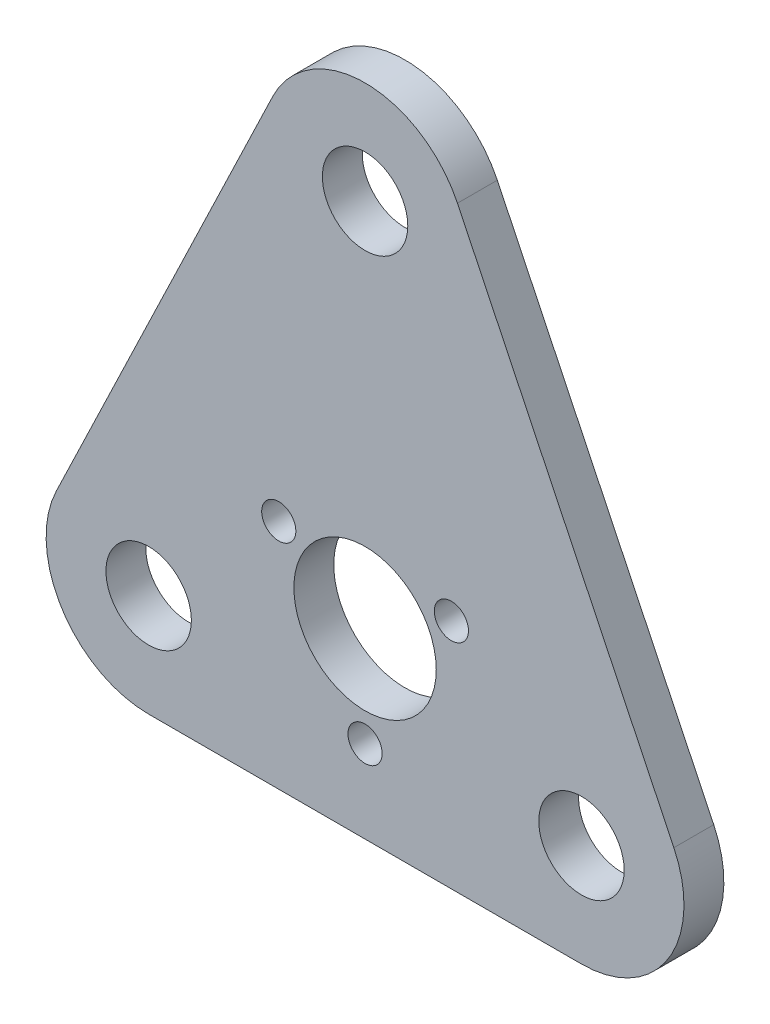
ISO-10303-21;
HEADER;
FILE_DESCRIPTION(('STEP AP214'),'2;1');
FILE_NAME('part.step','',(''),(''),'','','');
FILE_SCHEMA(('AUTOMOTIVE_DESIGN { 1 0 10303 214 1 1 1 1 }'));
ENDSEC;
DATA;
#1=APPLICATION_CONTEXT('core data for automotive mechanical design processes');
#2=APPLICATION_PROTOCOL_DEFINITION('international standard','automotive_design',2000,#1);
#3=PRODUCT_CONTEXT('',#1,'mechanical');
#4=PRODUCT('Part','Part','',(#3));
#5=PRODUCT_RELATED_PRODUCT_CATEGORY('part','',(#4));
#6=PRODUCT_DEFINITION_FORMATION('','',#4);
#7=PRODUCT_DEFINITION_CONTEXT('part definition',#1,'design');
#8=PRODUCT_DEFINITION('design','',#6,#7);
#9=PRODUCT_DEFINITION_SHAPE('','',#8);
#10=(LENGTH_UNIT() NAMED_UNIT(*) SI_UNIT(.MILLI.,.METRE.));
#11=(NAMED_UNIT(*) PLANE_ANGLE_UNIT() SI_UNIT($,.RADIAN.));
#12=(NAMED_UNIT(*) SI_UNIT($,.STERADIAN.) SOLID_ANGLE_UNIT());
#13=UNCERTAINTY_MEASURE_WITH_UNIT(LENGTH_MEASURE(1.E-05),#10,'distance_accuracy_value','');
#14=(GEOMETRIC_REPRESENTATION_CONTEXT(3) GLOBAL_UNCERTAINTY_ASSIGNED_CONTEXT((#13)) GLOBAL_UNIT_ASSIGNED_CONTEXT((#10,
#11,#12)) REPRESENTATION_CONTEXT('',''));
#15=CARTESIAN_POINT('',(0.,0.,0.));
#16=DIRECTION('',(0.,0.,1.));
#17=DIRECTION('',(1.,0.,0.));
#18=AXIS2_PLACEMENT_3D('',#15,#16,#17);
#19=CARTESIAN_POINT('',(0.,79.,3.5));
#20=DIRECTION('',(0.,0.,1.));
#21=DIRECTION('',(1.,0.,0.));
#22=AXIS2_PLACEMENT_3D('',#19,#20,#21);
#23=PLANE('',#22);
#24=CARTESIAN_POINT('',(15.1554445662277,22.75,3.5));
#25=DIRECTION('',(0.,0.,1.));
#26=DIRECTION('',(1.,0.,0.));
#27=AXIS2_PLACEMENT_3D('',#24,#25,#26);
#28=CIRCLE('',#27,3.);
#29=CARTESIAN_POINT('',(18.1554445662277,22.75,3.5));
#30=VERTEX_POINT('',#29);
#31=EDGE_CURVE('E258',#30,#30,#28,.T.);
#32=ORIENTED_EDGE('',*,*,#31,.F.);
#33=EDGE_LOOP('',(#32));
#34=FACE_BOUND('',#33,.T.);
#35=CARTESIAN_POINT('',(0.,14.,3.5));
#36=DIRECTION('',(0.,0.,1.));
#37=DIRECTION('',(1.,0.,0.));
#38=AXIS2_PLACEMENT_3D('',#35,#36,#37);
#39=CIRCLE('',#38,12.5);
#40=CARTESIAN_POINT('',(12.5,14.,3.5));
#41=VERTEX_POINT('',#40);
#42=EDGE_CURVE('E275',#41,#41,#39,.T.);
#43=ORIENTED_EDGE('',*,*,#42,.F.);
#44=EDGE_LOOP('',(#43));
#45=FACE_BOUND('',#44,.T.);
#46=CARTESIAN_POINT('',(38.,0.,3.5));
#47=DIRECTION('',(0.,0.,1.));
#48=DIRECTION('',(1.,0.,0.));
#49=AXIS2_PLACEMENT_3D('',#46,#47,#48);
#50=CIRCLE('',#49,7.5);
#51=CARTESIAN_POINT('',(45.5,0.,3.5));
#52=VERTEX_POINT('',#51);
#53=EDGE_CURVE('E286',#52,#52,#50,.T.);
#54=ORIENTED_EDGE('',*,*,#53,.F.);
#55=EDGE_LOOP('',(#54));
#56=FACE_BOUND('',#55,.T.);
#57=CARTESIAN_POINT('',(0.,79.,3.5));
#58=DIRECTION('',(0.,0.,1.));
#59=DIRECTION('',(1.,0.,0.));
#60=AXIS2_PLACEMENT_3D('',#57,#58,#59);
#61=CIRCLE('',#60,18.);
#62=CARTESIAN_POINT('',(16.2210013513531,86.8025069791319,3.5));
#63=VERTEX_POINT('',#62);
#64=CARTESIAN_POINT('',(-16.2210013513531,86.8025069791319,3.5));
#65=VERTEX_POINT('',#64);
#66=EDGE_CURVE('E174',#63,#65,#61,.T.);
#67=ORIENTED_EDGE('',*,*,#66,.T.);
#68=DIRECTION('',(-0.43347260995177,-0.901166741741838,0.));
#69=VECTOR('',#68,1.);
#70=CARTESIAN_POINT('',(-16.2210013513531,86.8025069791319,3.5));
#71=LINE('',#70,#69);
#72=CARTESIAN_POINT('',(-54.2210013513531,7.80250697913186,3.5));
#73=VERTEX_POINT('',#72);
#74=EDGE_CURVE('E120',#65,#73,#71,.T.);
#75=ORIENTED_EDGE('',*,*,#74,.T.);
#76=CARTESIAN_POINT('',(-38.,0.,3.5));
#77=DIRECTION('',(0.,0.,1.));
#78=DIRECTION('',(1.,0.,0.));
#79=AXIS2_PLACEMENT_3D('',#76,#77,#78);
#80=CIRCLE('',#79,18.);
#81=CARTESIAN_POINT('',(-38.,-18.,3.5));
#82=VERTEX_POINT('',#81);
#83=EDGE_CURVE('E133',#73,#82,#80,.T.);
#84=ORIENTED_EDGE('',*,*,#83,.T.);
#85=DIRECTION('',(1.,0.,0.));
#86=VECTOR('',#85,1.);
#87=CARTESIAN_POINT('',(-38.,-18.,3.5));
#88=LINE('',#87,#86);
#89=CARTESIAN_POINT('',(38.,-18.,3.5));
#90=VERTEX_POINT('',#89);
#91=EDGE_CURVE('E130',#82,#90,#88,.T.);
#92=ORIENTED_EDGE('',*,*,#91,.T.);
#93=CARTESIAN_POINT('',(38.,0.,3.5));
#94=DIRECTION('',(0.,0.,1.));
#95=DIRECTION('',(1.,0.,0.));
#96=AXIS2_PLACEMENT_3D('',#93,#94,#95);
#97=CIRCLE('',#96,18.);
#98=CARTESIAN_POINT('',(54.2210013513531,7.80250697913187,3.5));
#99=VERTEX_POINT('',#98);
#100=EDGE_CURVE('E131',#90,#99,#97,.T.);
#101=ORIENTED_EDGE('',*,*,#100,.T.);
#102=DIRECTION('',(-0.43347260995177,0.901166741741838,0.));
#103=VECTOR('',#102,1.);
#104=CARTESIAN_POINT('',(16.2210013513531,86.8025069791319,3.5));
#105=LINE('',#104,#103);
#106=EDGE_CURVE('E81',#99,#63,#105,.T.);
#107=ORIENTED_EDGE('',*,*,#106,.T.);
#108=EDGE_LOOP('',(#67,#75,#84,#92,#101,#107));
#109=FACE_BOUND('',#108,.T.);
#110=CARTESIAN_POINT('',(-38.,0.,3.5));
#111=DIRECTION('',(0.,0.,1.));
#112=DIRECTION('',(1.,0.,0.));
#113=AXIS2_PLACEMENT_3D('',#110,#111,#112);
#114=CIRCLE('',#113,7.5);
#115=CARTESIAN_POINT('',(-30.5,0.,3.5));
#116=VERTEX_POINT('',#115);
#117=EDGE_CURVE('E162',#116,#116,#114,.T.);
#118=ORIENTED_EDGE('',*,*,#117,.F.);
#119=EDGE_LOOP('',(#118));
#120=FACE_BOUND('',#119,.T.);
#121=CARTESIAN_POINT('',(0.,79.,3.5));
#122=DIRECTION('',(0.,0.,1.));
#123=DIRECTION('',(1.,0.,0.));
#124=AXIS2_PLACEMENT_3D('',#121,#122,#123);
#125=CIRCLE('',#124,7.5);
#126=CARTESIAN_POINT('',(7.50000000000001,79.,3.5));
#127=VERTEX_POINT('',#126);
#128=EDGE_CURVE('E279',#127,#127,#125,.T.);
#129=ORIENTED_EDGE('',*,*,#128,.F.);
#130=EDGE_LOOP('',(#129));
#131=FACE_BOUND('',#130,.T.);
#132=CARTESIAN_POINT('',(-15.1554445662277,22.7499999999999,3.5));
#133=DIRECTION('',(0.,0.,1.));
#134=DIRECTION('',(1.,0.,0.));
#135=AXIS2_PLACEMENT_3D('',#132,#133,#134);
#136=CIRCLE('',#135,3.);
#137=CARTESIAN_POINT('',(-12.1554445662277,22.7499999999999,3.5));
#138=VERTEX_POINT('',#137);
#139=EDGE_CURVE('E264',#138,#138,#136,.T.);
#140=ORIENTED_EDGE('',*,*,#139,.F.);
#141=EDGE_LOOP('',(#140));
#142=FACE_BOUND('',#141,.T.);
#143=CARTESIAN_POINT('',(0.,-3.5,3.5));
#144=DIRECTION('',(0.,0.,1.));
#145=DIRECTION('',(1.,0.,0.));
#146=AXIS2_PLACEMENT_3D('',#143,#144,#145);
#147=CIRCLE('',#146,3.);
#148=CARTESIAN_POINT('',(3.00000000000001,-3.5,3.5));
#149=VERTEX_POINT('',#148);
#150=EDGE_CURVE('E241',#149,#149,#147,.T.);
#151=ORIENTED_EDGE('',*,*,#150,.F.);
#152=EDGE_LOOP('',(#151));
#153=FACE_BOUND('',#152,.T.);
#154=ADVANCED_FACE('F62',(#34,#45,#56,#109,#120,#131,#142,#153),#23,.T.);
#155=CARTESIAN_POINT('',(0.,79.,-3.5));
#156=DIRECTION('',(0.,0.,1.));
#157=DIRECTION('',(1.,0.,0.));
#158=AXIS2_PLACEMENT_3D('',#155,#156,#157);
#159=PLANE('',#158);
#160=CARTESIAN_POINT('',(0.,79.,-3.5));
#161=DIRECTION('',(0.,0.,1.));
#162=DIRECTION('',(1.,0.,0.));
#163=AXIS2_PLACEMENT_3D('',#160,#161,#162);
#164=CIRCLE('',#163,18.);
#165=CARTESIAN_POINT('',(16.2210013513531,86.8025069791319,-3.5));
#166=VERTEX_POINT('',#165);
#167=CARTESIAN_POINT('',(-16.2210013513531,86.8025069791319,-3.5));
#168=VERTEX_POINT('',#167);
#169=EDGE_CURVE('E160',#166,#168,#164,.T.);
#170=ORIENTED_EDGE('',*,*,#169,.F.);
#171=DIRECTION('',(-0.43347260995177,0.901166741741838,0.));
#172=VECTOR('',#171,1.);
#173=CARTESIAN_POINT('',(16.2210013513531,86.8025069791319,-3.5));
#174=LINE('',#173,#172);
#175=CARTESIAN_POINT('',(54.2210013513531,7.80250697913187,-3.5));
#176=VERTEX_POINT('',#175);
#177=EDGE_CURVE('E115',#176,#166,#174,.T.);
#178=ORIENTED_EDGE('',*,*,#177,.F.);
#179=CARTESIAN_POINT('',(38.,0.,-3.5));
#180=DIRECTION('',(0.,0.,1.));
#181=DIRECTION('',(1.,0.,0.));
#182=AXIS2_PLACEMENT_3D('',#179,#180,#181);
#183=CIRCLE('',#182,18.);
#184=CARTESIAN_POINT('',(38.,-18.,-3.5));
#185=VERTEX_POINT('',#184);
#186=EDGE_CURVE('E108',#185,#176,#183,.T.);
#187=ORIENTED_EDGE('',*,*,#186,.F.);
#188=DIRECTION('',(1.,0.,0.));
#189=VECTOR('',#188,1.);
#190=CARTESIAN_POINT('',(-38.,-18.,-3.5));
#191=LINE('',#190,#189);
#192=CARTESIAN_POINT('',(-38.,-18.,-3.5));
#193=VERTEX_POINT('',#192);
#194=EDGE_CURVE('E145',#193,#185,#191,.T.);
#195=ORIENTED_EDGE('',*,*,#194,.F.);
#196=CARTESIAN_POINT('',(-38.,0.,-3.5));
#197=DIRECTION('',(0.,0.,1.));
#198=DIRECTION('',(1.,0.,0.));
#199=AXIS2_PLACEMENT_3D('',#196,#197,#198);
#200=CIRCLE('',#199,18.);
#201=CARTESIAN_POINT('',(-54.2210013513531,7.80250697913186,-3.5));
#202=VERTEX_POINT('',#201);
#203=EDGE_CURVE('E165',#202,#193,#200,.T.);
#204=ORIENTED_EDGE('',*,*,#203,.F.);
#205=DIRECTION('',(-0.43347260995177,-0.901166741741838,0.));
#206=VECTOR('',#205,1.);
#207=CARTESIAN_POINT('',(-16.2210013513531,86.8025069791319,-3.5));
#208=LINE('',#207,#206);
#209=EDGE_CURVE('E161',#168,#202,#208,.T.);
#210=ORIENTED_EDGE('',*,*,#209,.F.);
#211=EDGE_LOOP('',(#170,#178,#187,#195,#204,#210));
#212=FACE_BOUND('',#211,.T.);
#213=CARTESIAN_POINT('',(-38.,0.,-3.5));
#214=DIRECTION('',(0.,0.,1.));
#215=DIRECTION('',(1.,0.,0.));
#216=AXIS2_PLACEMENT_3D('',#213,#214,#215);
#217=CIRCLE('',#216,7.5);
#218=CARTESIAN_POINT('',(-30.5,0.,-3.5));
#219=VERTEX_POINT('',#218);
#220=EDGE_CURVE('E295',#219,#219,#217,.T.);
#221=ORIENTED_EDGE('',*,*,#220,.T.);
#222=EDGE_LOOP('',(#221));
#223=FACE_BOUND('',#222,.T.);
#224=CARTESIAN_POINT('',(38.,0.,-3.5));
#225=DIRECTION('',(0.,0.,1.));
#226=DIRECTION('',(1.,0.,0.));
#227=AXIS2_PLACEMENT_3D('',#224,#225,#226);
#228=CIRCLE('',#227,7.5);
#229=CARTESIAN_POINT('',(45.5,0.,-3.5));
#230=VERTEX_POINT('',#229);
#231=EDGE_CURVE('E281',#230,#230,#228,.T.);
#232=ORIENTED_EDGE('',*,*,#231,.T.);
#233=EDGE_LOOP('',(#232));
#234=FACE_BOUND('',#233,.T.);
#235=CARTESIAN_POINT('',(0.,79.,-3.5));
#236=DIRECTION('',(0.,0.,1.));
#237=DIRECTION('',(1.,0.,0.));
#238=AXIS2_PLACEMENT_3D('',#235,#236,#237);
#239=CIRCLE('',#238,7.5);
#240=CARTESIAN_POINT('',(7.50000000000001,79.,-3.5));
#241=VERTEX_POINT('',#240);
#242=EDGE_CURVE('E276',#241,#241,#239,.T.);
#243=ORIENTED_EDGE('',*,*,#242,.T.);
#244=EDGE_LOOP('',(#243));
#245=FACE_BOUND('',#244,.T.);
#246=CARTESIAN_POINT('',(0.,14.,-3.5));
#247=DIRECTION('',(0.,0.,1.));
#248=DIRECTION('',(1.,0.,0.));
#249=AXIS2_PLACEMENT_3D('',#246,#247,#248);
#250=CIRCLE('',#249,12.5);
#251=CARTESIAN_POINT('',(12.5,14.,-3.5));
#252=VERTEX_POINT('',#251);
#253=EDGE_CURVE('E268',#252,#252,#250,.T.);
#254=ORIENTED_EDGE('',*,*,#253,.T.);
#255=EDGE_LOOP('',(#254));
#256=FACE_BOUND('',#255,.T.);
#257=CARTESIAN_POINT('',(-15.1554445662277,22.7499999999999,-3.5));
#258=DIRECTION('',(0.,0.,1.));
#259=DIRECTION('',(1.,0.,0.));
#260=AXIS2_PLACEMENT_3D('',#257,#258,#259);
#261=CIRCLE('',#260,3.);
#262=CARTESIAN_POINT('',(-12.1554445662277,22.7499999999999,-3.5));
#263=VERTEX_POINT('',#262);
#264=EDGE_CURVE('E259',#263,#263,#261,.T.);
#265=ORIENTED_EDGE('',*,*,#264,.T.);
#266=EDGE_LOOP('',(#265));
#267=FACE_BOUND('',#266,.T.);
#268=CARTESIAN_POINT('',(15.1554445662277,22.75,-3.5));
#269=DIRECTION('',(0.,0.,1.));
#270=DIRECTION('',(1.,0.,0.));
#271=AXIS2_PLACEMENT_3D('',#268,#269,#270);
#272=CIRCLE('',#271,3.);
#273=CARTESIAN_POINT('',(18.1554445662277,22.75,-3.5));
#274=VERTEX_POINT('',#273);
#275=EDGE_CURVE('E254',#274,#274,#272,.T.);
#276=ORIENTED_EDGE('',*,*,#275,.T.);
#277=EDGE_LOOP('',(#276));
#278=FACE_BOUND('',#277,.T.);
#279=CARTESIAN_POINT('',(0.,-3.5,-3.5));
#280=DIRECTION('',(0.,0.,1.));
#281=DIRECTION('',(1.,0.,0.));
#282=AXIS2_PLACEMENT_3D('',#279,#280,#281);
#283=CIRCLE('',#282,3.);
#284=CARTESIAN_POINT('',(3.00000000000001,-3.5,-3.5));
#285=VERTEX_POINT('',#284);
#286=EDGE_CURVE('E247',#285,#285,#283,.T.);
#287=ORIENTED_EDGE('',*,*,#286,.T.);
#288=EDGE_LOOP('',(#287));
#289=FACE_BOUND('',#288,.T.);
#290=ADVANCED_FACE('F188',(#212,#223,#234,#245,#256,#267,#278,#289),#159,.F.);
#291=CARTESIAN_POINT('',(0.,79.,3.5));
#292=DIRECTION('',(0.,0.,-1.));
#293=DIRECTION('',(-1.,0.,0.));
#294=AXIS2_PLACEMENT_3D('',#291,#292,#293);
#295=CYLINDRICAL_SURFACE('',#294,18.);
#296=ORIENTED_EDGE('',*,*,#169,.T.);
#297=DIRECTION('',(0.,0.,-1.));
#298=VECTOR('',#297,1.);
#299=CARTESIAN_POINT('',(-16.2210013513531,86.8025069791319,3.5));
#300=LINE('',#299,#298);
#301=EDGE_CURVE('E12',#65,#168,#300,.T.);
#302=ORIENTED_EDGE('',*,*,#301,.F.);
#303=ORIENTED_EDGE('',*,*,#66,.F.);
#304=DIRECTION('',(0.,0.,-1.));
#305=VECTOR('',#304,1.);
#306=CARTESIAN_POINT('',(16.2210013513531,86.8025069791319,3.5));
#307=LINE('',#306,#305);
#308=EDGE_CURVE('E151',#63,#166,#307,.T.);
#309=ORIENTED_EDGE('',*,*,#308,.T.);
#310=EDGE_LOOP('',(#296,#302,#303,#309));
#311=FACE_BOUND('',#310,.T.);
#312=ADVANCED_FACE('F70',(#311),#295,.T.);
#313=CARTESIAN_POINT('',(-16.2210013513531,86.8025069791319,3.5));
#314=DIRECTION('',(0.901166741741838,-0.43347260995177,0.));
#315=DIRECTION('',(0.43347260995177,0.901166741741838,0.));
#316=AXIS2_PLACEMENT_3D('',#313,#314,#315);
#317=PLANE('',#316);
#318=ORIENTED_EDGE('',*,*,#209,.T.);
#319=DIRECTION('',(0.,0.,-1.));
#320=VECTOR('',#319,1.);
#321=CARTESIAN_POINT('',(-54.2210013513531,7.80250697913186,3.5));
#322=LINE('',#321,#320);
#323=EDGE_CURVE('E75',#73,#202,#322,.T.);
#324=ORIENTED_EDGE('',*,*,#323,.F.);
#325=ORIENTED_EDGE('',*,*,#74,.F.);
#326=ORIENTED_EDGE('',*,*,#301,.T.);
#327=EDGE_LOOP('',(#318,#324,#325,#326));
#328=FACE_BOUND('',#327,.T.);
#329=ADVANCED_FACE('F448',(#328),#317,.F.);
#330=CARTESIAN_POINT('',(-38.,0.,3.5));
#331=DIRECTION('',(0.,0.,-1.));
#332=DIRECTION('',(-1.,0.,0.));
#333=AXIS2_PLACEMENT_3D('',#330,#331,#332);
#334=CYLINDRICAL_SURFACE('',#333,18.);
#335=ORIENTED_EDGE('',*,*,#203,.T.);
#336=DIRECTION('',(0.,0.,-1.));
#337=VECTOR('',#336,1.);
#338=CARTESIAN_POINT('',(-38.,-18.,3.5));
#339=LINE('',#338,#337);
#340=EDGE_CURVE('E143',#82,#193,#339,.T.);
#341=ORIENTED_EDGE('',*,*,#340,.F.);
#342=ORIENTED_EDGE('',*,*,#83,.F.);
#343=ORIENTED_EDGE('',*,*,#323,.T.);
#344=EDGE_LOOP('',(#335,#341,#342,#343));
#345=FACE_BOUND('',#344,.T.);
#346=ADVANCED_FACE('F186',(#345),#334,.T.);
#347=CARTESIAN_POINT('',(-38.,-18.,3.5));
#348=DIRECTION('',(0.,1.,0.));
#349=DIRECTION('',(0.,0.,1.));
#350=AXIS2_PLACEMENT_3D('',#347,#348,#349);
#351=PLANE('',#350);
#352=ORIENTED_EDGE('',*,*,#194,.T.);
#353=DIRECTION('',(0.,0.,-1.));
#354=VECTOR('',#353,1.);
#355=CARTESIAN_POINT('',(38.,-18.,3.5));
#356=LINE('',#355,#354);
#357=EDGE_CURVE('E137',#90,#185,#356,.T.);
#358=ORIENTED_EDGE('',*,*,#357,.F.);
#359=ORIENTED_EDGE('',*,*,#91,.F.);
#360=ORIENTED_EDGE('',*,*,#340,.T.);
#361=EDGE_LOOP('',(#352,#358,#359,#360));
#362=FACE_BOUND('',#361,.T.);
#363=ADVANCED_FACE('F139',(#362),#351,.F.);
#364=CARTESIAN_POINT('',(38.,0.,3.5));
#365=DIRECTION('',(0.,0.,-1.));
#366=DIRECTION('',(-1.,0.,0.));
#367=AXIS2_PLACEMENT_3D('',#364,#365,#366);
#368=CYLINDRICAL_SURFACE('',#367,18.);
#369=ORIENTED_EDGE('',*,*,#186,.T.);
#370=DIRECTION('',(0.,0.,-1.));
#371=VECTOR('',#370,1.);
#372=CARTESIAN_POINT('',(54.2210013513531,7.80250697913187,3.5));
#373=LINE('',#372,#371);
#374=EDGE_CURVE('E144',#99,#176,#373,.T.);
#375=ORIENTED_EDGE('',*,*,#374,.F.);
#376=ORIENTED_EDGE('',*,*,#100,.F.);
#377=ORIENTED_EDGE('',*,*,#357,.T.);
#378=EDGE_LOOP('',(#369,#375,#376,#377));
#379=FACE_BOUND('',#378,.T.);
#380=ADVANCED_FACE('F150',(#379),#368,.T.);
#381=CARTESIAN_POINT('',(16.2210013513531,86.8025069791319,3.5));
#382=DIRECTION('',(-0.901166741741838,-0.43347260995177,0.));
#383=DIRECTION('',(0.43347260995177,-0.901166741741838,0.));
#384=AXIS2_PLACEMENT_3D('',#381,#382,#383);
#385=PLANE('',#384);
#386=ORIENTED_EDGE('',*,*,#177,.T.);
#387=ORIENTED_EDGE('',*,*,#308,.F.);
#388=ORIENTED_EDGE('',*,*,#106,.F.);
#389=ORIENTED_EDGE('',*,*,#374,.T.);
#390=EDGE_LOOP('',(#386,#387,#388,#389));
#391=FACE_BOUND('',#390,.T.);
#392=ADVANCED_FACE('F191',(#391),#385,.F.);
#393=CARTESIAN_POINT('',(-38.,0.,3.5));
#394=DIRECTION('',(0.,0.,-1.));
#395=DIRECTION('',(-1.,0.,0.));
#396=AXIS2_PLACEMENT_3D('',#393,#394,#395);
#397=CYLINDRICAL_SURFACE('',#396,7.5);
#398=ORIENTED_EDGE('',*,*,#117,.T.);
#399=EDGE_LOOP('',(#398));
#400=FACE_BOUND('',#399,.T.);
#401=ORIENTED_EDGE('',*,*,#220,.F.);
#402=EDGE_LOOP('',(#401));
#403=FACE_BOUND('',#402,.T.);
#404=ADVANCED_FACE('F198',(#400,#403),#397,.F.);
#405=CARTESIAN_POINT('',(38.,0.,3.5));
#406=DIRECTION('',(0.,0.,-1.));
#407=DIRECTION('',(-1.,0.,0.));
#408=AXIS2_PLACEMENT_3D('',#405,#406,#407);
#409=CYLINDRICAL_SURFACE('',#408,7.5);
#410=ORIENTED_EDGE('',*,*,#53,.T.);
#411=EDGE_LOOP('',(#410));
#412=FACE_BOUND('',#411,.T.);
#413=ORIENTED_EDGE('',*,*,#231,.F.);
#414=EDGE_LOOP('',(#413));
#415=FACE_BOUND('',#414,.T.);
#416=ADVANCED_FACE('F205',(#412,#415),#409,.F.);
#417=CARTESIAN_POINT('',(0.,79.,3.5));
#418=DIRECTION('',(0.,0.,-1.));
#419=DIRECTION('',(-1.,0.,0.));
#420=AXIS2_PLACEMENT_3D('',#417,#418,#419);
#421=CYLINDRICAL_SURFACE('',#420,7.5);
#422=ORIENTED_EDGE('',*,*,#128,.T.);
#423=EDGE_LOOP('',(#422));
#424=FACE_BOUND('',#423,.T.);
#425=ORIENTED_EDGE('',*,*,#242,.F.);
#426=EDGE_LOOP('',(#425));
#427=FACE_BOUND('',#426,.T.);
#428=ADVANCED_FACE('F216',(#424,#427),#421,.F.);
#429=CARTESIAN_POINT('',(0.,14.,3.5));
#430=DIRECTION('',(0.,0.,-1.));
#431=DIRECTION('',(-1.,0.,0.));
#432=AXIS2_PLACEMENT_3D('',#429,#430,#431);
#433=CYLINDRICAL_SURFACE('',#432,12.5);
#434=ORIENTED_EDGE('',*,*,#42,.T.);
#435=EDGE_LOOP('',(#434));
#436=FACE_BOUND('',#435,.T.);
#437=ORIENTED_EDGE('',*,*,#253,.F.);
#438=EDGE_LOOP('',(#437));
#439=FACE_BOUND('',#438,.T.);
#440=ADVANCED_FACE('F225',(#436,#439),#433,.F.);
#441=CARTESIAN_POINT('',(-15.1554445662277,22.7499999999999,3.5));
#442=DIRECTION('',(0.,0.,-1.));
#443=DIRECTION('',(-1.,0.,0.));
#444=AXIS2_PLACEMENT_3D('',#441,#442,#443);
#445=CYLINDRICAL_SURFACE('',#444,3.);
#446=ORIENTED_EDGE('',*,*,#139,.T.);
#447=EDGE_LOOP('',(#446));
#448=FACE_BOUND('',#447,.T.);
#449=ORIENTED_EDGE('',*,*,#264,.F.);
#450=EDGE_LOOP('',(#449));
#451=FACE_BOUND('',#450,.T.);
#452=ADVANCED_FACE('F226',(#448,#451),#445,.F.);
#453=CARTESIAN_POINT('',(15.1554445662277,22.75,3.5));
#454=DIRECTION('',(0.,0.,-1.));
#455=DIRECTION('',(-1.,0.,0.));
#456=AXIS2_PLACEMENT_3D('',#453,#454,#455);
#457=CYLINDRICAL_SURFACE('',#456,3.);
#458=ORIENTED_EDGE('',*,*,#31,.T.);
#459=EDGE_LOOP('',(#458));
#460=FACE_BOUND('',#459,.T.);
#461=ORIENTED_EDGE('',*,*,#275,.F.);
#462=EDGE_LOOP('',(#461));
#463=FACE_BOUND('',#462,.T.);
#464=ADVANCED_FACE('F229',(#460,#463),#457,.F.);
#465=CARTESIAN_POINT('',(0.,-3.5,3.5));
#466=DIRECTION('',(0.,0.,-1.));
#467=DIRECTION('',(-1.,0.,0.));
#468=AXIS2_PLACEMENT_3D('',#465,#466,#467);
#469=CYLINDRICAL_SURFACE('',#468,3.);
#470=ORIENTED_EDGE('',*,*,#150,.T.);
#471=EDGE_LOOP('',(#470));
#472=FACE_BOUND('',#471,.T.);
#473=ORIENTED_EDGE('',*,*,#286,.F.);
#474=EDGE_LOOP('',(#473));
#475=FACE_BOUND('',#474,.T.);
#476=ADVANCED_FACE('F233',(#472,#475),#469,.F.);
#477=CLOSED_SHELL('',(#154,#290,#312,#329,#346,#363,#380,#392,#404,#416,#428,#440,#452,#464,#476));
#478=MANIFOLD_SOLID_BREP('B2',#477);
#479=ADVANCED_BREP_SHAPE_REPRESENTATION('',(#18,#478),#14);
#480=SHAPE_DEFINITION_REPRESENTATION(#9,#479);
ENDSEC;
END-ISO-10303-21;
